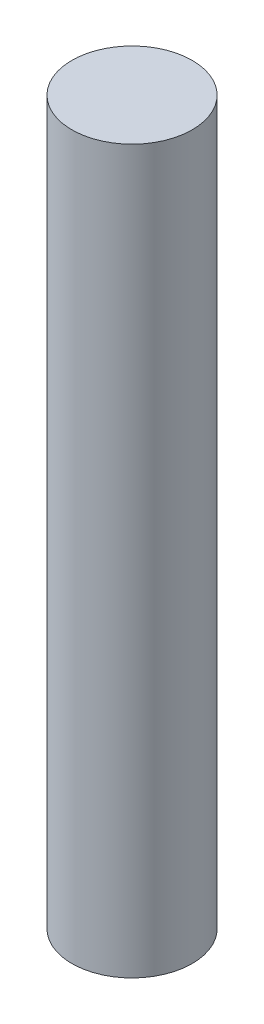
ISO-10303-21;
HEADER;
FILE_DESCRIPTION(('STEP AP214'),'2;1');
FILE_NAME('part.step','',(''),(''),'','','');
FILE_SCHEMA(('AUTOMOTIVE_DESIGN { 1 0 10303 214 1 1 1 1 }'));
ENDSEC;
DATA;
#1=APPLICATION_CONTEXT('core data for automotive mechanical design processes');
#2=APPLICATION_PROTOCOL_DEFINITION('international standard','automotive_design',2000,#1);
#3=PRODUCT_CONTEXT('',#1,'mechanical');
#4=PRODUCT('Part','Part','',(#3));
#5=PRODUCT_RELATED_PRODUCT_CATEGORY('part','',(#4));
#6=PRODUCT_DEFINITION_FORMATION('','',#4);
#7=PRODUCT_DEFINITION_CONTEXT('part definition',#1,'design');
#8=PRODUCT_DEFINITION('design','',#6,#7);
#9=PRODUCT_DEFINITION_SHAPE('','',#8);
#10=(LENGTH_UNIT() NAMED_UNIT(*) SI_UNIT(.MILLI.,.METRE.));
#11=(NAMED_UNIT(*) PLANE_ANGLE_UNIT() SI_UNIT($,.RADIAN.));
#12=(NAMED_UNIT(*) SI_UNIT($,.STERADIAN.) SOLID_ANGLE_UNIT());
#13=UNCERTAINTY_MEASURE_WITH_UNIT(LENGTH_MEASURE(1.E-05),#10,'distance_accuracy_value','');
#14=(GEOMETRIC_REPRESENTATION_CONTEXT(3) GLOBAL_UNCERTAINTY_ASSIGNED_CONTEXT((#13)) GLOBAL_UNIT_ASSIGNED_CONTEXT((#10,
#11,#12)) REPRESENTATION_CONTEXT('',''));
#15=CARTESIAN_POINT('',(0.,0.,0.));
#16=DIRECTION('',(0.,0.,1.));
#17=DIRECTION('',(1.,0.,0.));
#18=AXIS2_PLACEMENT_3D('',#15,#16,#17);
#19=CARTESIAN_POINT('',(0.,76.2,0.));
#20=DIRECTION('',(0.,-1.,0.));
#21=DIRECTION('',(0.,0.,-1.));
#22=AXIS2_PLACEMENT_3D('',#19,#20,#21);
#23=CYLINDRICAL_SURFACE('',#22,6.35);
#24=CARTESIAN_POINT('',(0.,76.2,0.));
#25=DIRECTION('',(0.,1.,0.));
#26=DIRECTION('',(0.,0.,1.));
#27=AXIS2_PLACEMENT_3D('',#24,#25,#26);
#28=CIRCLE('',#27,6.35);
#29=CARTESIAN_POINT('',(0.,76.2,-6.35));
#30=VERTEX_POINT('',#29);
#31=EDGE_CURVE('E10',#30,#30,#28,.T.);
#32=CARTESIAN_POINT('',(0.,0.,0.));
#33=DIRECTION('',(0.,1.,0.));
#34=DIRECTION('',(0.,0.,1.));
#35=AXIS2_PLACEMENT_3D('',#32,#33,#34);
#36=CIRCLE('',#35,6.35);
#37=CARTESIAN_POINT('',(0.,0.,-6.35));
#38=VERTEX_POINT('',#37);
#39=EDGE_CURVE('E42',#38,#38,#36,.T.);
#40=CARTESIAN_POINT('',(0.,76.2,-6.35));
#41=CARTESIAN_POINT('',(0.,75.40625,-6.35));
#42=CARTESIAN_POINT('',(0.,74.6125,-6.35));
#43=CARTESIAN_POINT('',(0.,73.025,-6.35));
#44=CARTESIAN_POINT('',(0.,72.23125,-6.35));
#45=CARTESIAN_POINT('',(0.,70.64375,-6.35));
#46=CARTESIAN_POINT('',(0.,69.85,-6.35));
#47=CARTESIAN_POINT('',(0.,68.2625,-6.35));
#48=CARTESIAN_POINT('',(0.,67.46875,-6.35));
#49=CARTESIAN_POINT('',(0.,65.88125,-6.35));
#50=CARTESIAN_POINT('',(0.,65.0875,-6.35));
#51=CARTESIAN_POINT('',(0.,63.5,-6.35));
#52=CARTESIAN_POINT('',(0.,62.70625,-6.35));
#53=CARTESIAN_POINT('',(0.,61.11875,-6.35));
#54=CARTESIAN_POINT('',(0.,60.325,-6.35));
#55=CARTESIAN_POINT('',(0.,58.7375,-6.35));
#56=CARTESIAN_POINT('',(0.,57.94375,-6.35));
#57=CARTESIAN_POINT('',(0.,56.35625,-6.35));
#58=CARTESIAN_POINT('',(0.,55.5625,-6.35));
#59=CARTESIAN_POINT('',(0.,53.975,-6.35));
#60=CARTESIAN_POINT('',(0.,53.18125,-6.35));
#61=CARTESIAN_POINT('',(0.,51.59375,-6.35));
#62=CARTESIAN_POINT('',(0.,50.8,-6.35));
#63=CARTESIAN_POINT('',(0.,49.2125,-6.35));
#64=CARTESIAN_POINT('',(0.,48.41875,-6.35));
#65=CARTESIAN_POINT('',(0.,46.83125,-6.35));
#66=CARTESIAN_POINT('',(0.,46.0375,-6.35));
#67=CARTESIAN_POINT('',(0.,44.45,-6.35));
#68=CARTESIAN_POINT('',(0.,43.65625,-6.35));
#69=CARTESIAN_POINT('',(0.,42.06875,-6.35));
#70=CARTESIAN_POINT('',(0.,41.275,-6.35));
#71=CARTESIAN_POINT('',(0.,39.6875,-6.35));
#72=CARTESIAN_POINT('',(0.,38.89375,-6.35));
#73=CARTESIAN_POINT('',(0.,37.30625,-6.35));
#74=CARTESIAN_POINT('',(0.,36.5125,-6.35));
#75=CARTESIAN_POINT('',(0.,34.925,-6.35));
#76=CARTESIAN_POINT('',(0.,34.13125,-6.35));
#77=CARTESIAN_POINT('',(0.,32.54375,-6.35));
#78=CARTESIAN_POINT('',(0.,31.75,-6.35));
#79=CARTESIAN_POINT('',(0.,30.1625,-6.35));
#80=CARTESIAN_POINT('',(0.,29.36875,-6.35));
#81=CARTESIAN_POINT('',(0.,27.78125,-6.35));
#82=CARTESIAN_POINT('',(0.,26.9875,-6.35));
#83=CARTESIAN_POINT('',(0.,25.4,-6.35));
#84=CARTESIAN_POINT('',(0.,24.60625,-6.35));
#85=CARTESIAN_POINT('',(0.,23.01875,-6.35));
#86=CARTESIAN_POINT('',(0.,22.225,-6.35));
#87=CARTESIAN_POINT('',(0.,20.6375,-6.35));
#88=CARTESIAN_POINT('',(0.,19.84375,-6.35));
#89=CARTESIAN_POINT('',(0.,18.25625,-6.35));
#90=CARTESIAN_POINT('',(0.,17.4625,-6.35));
#91=CARTESIAN_POINT('',(0.,15.875,-6.35));
#92=CARTESIAN_POINT('',(0.,15.08125,-6.35));
#93=CARTESIAN_POINT('',(0.,13.49375,-6.35));
#94=CARTESIAN_POINT('',(0.,12.7,-6.35));
#95=CARTESIAN_POINT('',(0.,11.1125,-6.35));
#96=CARTESIAN_POINT('',(0.,10.31875,-6.35));
#97=CARTESIAN_POINT('',(0.,8.73125,-6.35));
#98=CARTESIAN_POINT('',(0.,7.93750000000001,-6.35));
#99=CARTESIAN_POINT('',(0.,6.35,-6.35));
#100=CARTESIAN_POINT('',(0.,5.55625,-6.35));
#101=CARTESIAN_POINT('',(0.,3.96875,-6.35));
#102=CARTESIAN_POINT('',(0.,3.175,-6.35));
#103=CARTESIAN_POINT('',(0.,1.5875,-6.35));
#104=CARTESIAN_POINT('',(0.,0.793750000000001,-6.35));
#105=CARTESIAN_POINT('',(0.,0.,-6.35));
#106=B_SPLINE_CURVE_WITH_KNOTS('',3,(#40,#41,#42,#43,#44,#45,#46,#47,#48,#49,#50,#51,#52,#53,
#54,#55,#56,#57,#58,#59,#60,#61,#62,#63,#64,#65,#66,#67,#68,#69,#70,#71,#72,#73,#74,#75,#76,#77,
#78,#79,#80,#81,#82,#83,#84,#85,#86,#87,#88,#89,#90,#91,#92,#93,#94,#95,#96,#97,#98,#99,#100,
#101,#102,#103,#104,#105),.UNSPECIFIED.,.F.,.F.,(4,2,2,2,2,2,2,2,2,2,2,2,2,2,2,2,2,2,2,2,2,2,2,
2,2,2,2,2,2,2,2,2,4),(0.,2.38124999999999,4.76249999999999,7.14374999999999,9.52499999999999,
11.90625,14.2875,16.66875,19.05,21.43125,23.8125,26.19375,28.575,30.95625,33.3375,35.71875,38.1,
40.48125,42.8625,45.24375,47.625,50.00625,52.3875,54.76875,57.15,59.53125,61.9125,64.29375,
66.675,69.05625,71.4375,73.81875,76.2),.UNSPECIFIED.);
#107=EDGE_CURVE('BSEAM39',#30,#38,#106,.T.);
#108=ORIENTED_EDGE('',*,*,#31,.F.);
#109=ORIENTED_EDGE('',*,*,#39,.T.);
#110=ORIENTED_EDGE('',*,*,#107,.T.);
#111=ORIENTED_EDGE('',*,*,#107,.F.);
#112=EDGE_LOOP('',(#108,#110,#109,#111));
#113=FACE_BOUND('',#112,.T.);
#114=ADVANCED_FACE('F39',(#113),#23,.T.);
#115=CARTESIAN_POINT('',(0.,76.2,0.));
#116=DIRECTION('',(0.,1.,0.));
#117=DIRECTION('',(0.,0.,1.));
#118=AXIS2_PLACEMENT_3D('',#115,#116,#117);
#119=PLANE('',#118);
#120=ORIENTED_EDGE('',*,*,#31,.T.);
#121=EDGE_LOOP('',(#120));
#122=FACE_BOUND('',#121,.T.);
#123=ADVANCED_FACE('F54',(#122),#119,.T.);
#124=CARTESIAN_POINT('',(0.,0.,0.));
#125=DIRECTION('',(0.,1.,0.));
#126=DIRECTION('',(0.,0.,1.));
#127=AXIS2_PLACEMENT_3D('',#124,#125,#126);
#128=PLANE('',#127);
#129=ORIENTED_EDGE('',*,*,#39,.F.);
#130=EDGE_LOOP('',(#129));
#131=FACE_BOUND('',#130,.T.);
#132=ADVANCED_FACE('F52',(#131),#128,.F.);
#133=CLOSED_SHELL('',(#114,#123,#132));
#134=MANIFOLD_SOLID_BREP('B2',#133);
#135=ADVANCED_BREP_SHAPE_REPRESENTATION('',(#18,#134),#14);
#136=SHAPE_DEFINITION_REPRESENTATION(#9,#135);
ENDSEC;
END-ISO-10303-21;
